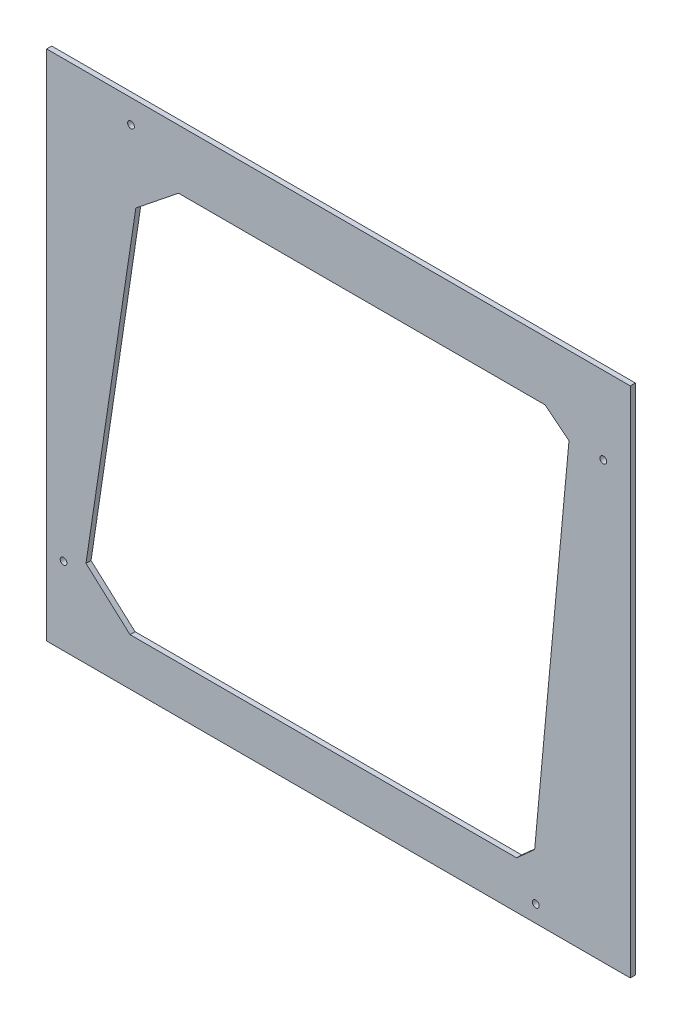
ISO-10303-21;
HEADER;
FILE_DESCRIPTION(('STEP AP214'),'2;1');
FILE_NAME('part.step','',(''),(''),'','','');
FILE_SCHEMA(('AUTOMOTIVE_DESIGN { 1 0 10303 214 1 1 1 1 }'));
ENDSEC;
DATA;
#1=APPLICATION_CONTEXT('core data for automotive mechanical design processes');
#2=APPLICATION_PROTOCOL_DEFINITION('international standard','automotive_design',2000,#1);
#3=PRODUCT_CONTEXT('',#1,'mechanical');
#4=PRODUCT('Part','Part','',(#3));
#5=PRODUCT_RELATED_PRODUCT_CATEGORY('part','',(#4));
#6=PRODUCT_DEFINITION_FORMATION('','',#4);
#7=PRODUCT_DEFINITION_CONTEXT('part definition',#1,'design');
#8=PRODUCT_DEFINITION('design','',#6,#7);
#9=PRODUCT_DEFINITION_SHAPE('','',#8);
#10=(LENGTH_UNIT() NAMED_UNIT(*) SI_UNIT(.MILLI.,.METRE.));
#11=(NAMED_UNIT(*) PLANE_ANGLE_UNIT() SI_UNIT($,.RADIAN.));
#12=(NAMED_UNIT(*) SI_UNIT($,.STERADIAN.) SOLID_ANGLE_UNIT());
#13=UNCERTAINTY_MEASURE_WITH_UNIT(LENGTH_MEASURE(1.E-05),#10,'distance_accuracy_value','');
#14=(GEOMETRIC_REPRESENTATION_CONTEXT(3) GLOBAL_UNCERTAINTY_ASSIGNED_CONTEXT((#13)) GLOBAL_UNIT_ASSIGNED_CONTEXT((#10,
#11,#12)) REPRESENTATION_CONTEXT('',''));
#15=CARTESIAN_POINT('',(0.,0.,0.));
#16=DIRECTION('',(0.,0.,1.));
#17=DIRECTION('',(1.,0.,0.));
#18=AXIS2_PLACEMENT_3D('',#15,#16,#17);
#19=CARTESIAN_POINT('',(0.,152.,3.));
#20=DIRECTION('',(0.,-1.,0.));
#21=DIRECTION('',(1.,0.,0.));
#22=AXIS2_PLACEMENT_3D('',#19,#20,#21);
#23=PLANE('',#22);
#24=DIRECTION('',(-1.,0.,0.));
#25=VECTOR('',#24,1.);
#26=CARTESIAN_POINT('',(0.,152.,0.));
#27=LINE('',#26,#25);
#28=CARTESIAN_POINT('',(176.,152.,0.));
#29=VERTEX_POINT('',#28);
#30=CARTESIAN_POINT('',(-170.,152.,0.));
#31=VERTEX_POINT('',#30);
#32=EDGE_CURVE('E195',#29,#31,#27,.T.);
#33=ORIENTED_EDGE('',*,*,#32,.T.);
#34=DIRECTION('',(0.,0.,-1.));
#35=VECTOR('',#34,1.);
#36=CARTESIAN_POINT('',(-170.,152.,3.));
#37=LINE('',#36,#35);
#38=CARTESIAN_POINT('',(-170.,152.,3.));
#39=VERTEX_POINT('',#38);
#40=EDGE_CURVE('E11',#39,#31,#37,.T.);
#41=ORIENTED_EDGE('',*,*,#40,.F.);
#42=DIRECTION('',(-1.,0.,0.));
#43=VECTOR('',#42,1.);
#44=CARTESIAN_POINT('',(0.,152.,3.));
#45=LINE('',#44,#43);
#46=CARTESIAN_POINT('',(176.,152.,3.));
#47=VERTEX_POINT('',#46);
#48=EDGE_CURVE('E142',#47,#39,#45,.T.);
#49=ORIENTED_EDGE('',*,*,#48,.F.);
#50=DIRECTION('',(0.,0.,-1.));
#51=VECTOR('',#50,1.);
#52=CARTESIAN_POINT('',(176.,152.,3.));
#53=LINE('',#52,#51);
#54=EDGE_CURVE('E58',#47,#29,#53,.T.);
#55=ORIENTED_EDGE('',*,*,#54,.T.);
#56=EDGE_LOOP('',(#33,#41,#49,#55));
#57=FACE_BOUND('',#56,.T.);
#58=ADVANCED_FACE('F39',(#57),#23,.F.);
#59=CARTESIAN_POINT('',(-170.,0.,3.));
#60=DIRECTION('',(1.,0.,0.));
#61=DIRECTION('',(0.,1.,0.));
#62=AXIS2_PLACEMENT_3D('',#59,#60,#61);
#63=PLANE('',#62);
#64=DIRECTION('',(0.,-1.,0.));
#65=VECTOR('',#64,1.);
#66=CARTESIAN_POINT('',(-170.,0.,0.));
#67=LINE('',#66,#65);
#68=CARTESIAN_POINT('',(-170.,-152.,0.));
#69=VERTEX_POINT('',#68);
#70=EDGE_CURVE('E148',#31,#69,#67,.T.);
#71=ORIENTED_EDGE('',*,*,#70,.T.);
#72=DIRECTION('',(0.,0.,-1.));
#73=VECTOR('',#72,1.);
#74=CARTESIAN_POINT('',(-170.,-152.,3.));
#75=LINE('',#74,#73);
#76=CARTESIAN_POINT('',(-170.,-152.,3.));
#77=VERTEX_POINT('',#76);
#78=EDGE_CURVE('E49',#77,#69,#75,.T.);
#79=ORIENTED_EDGE('',*,*,#78,.F.);
#80=DIRECTION('',(0.,-1.,0.));
#81=VECTOR('',#80,1.);
#82=CARTESIAN_POINT('',(-170.,0.,3.));
#83=LINE('',#82,#81);
#84=EDGE_CURVE('E136',#39,#77,#83,.T.);
#85=ORIENTED_EDGE('',*,*,#84,.F.);
#86=ORIENTED_EDGE('',*,*,#40,.T.);
#87=EDGE_LOOP('',(#71,#79,#85,#86));
#88=FACE_BOUND('',#87,.T.);
#89=ADVANCED_FACE('F147',(#88),#63,.F.);
#90=CARTESIAN_POINT('',(0.,-152.,3.));
#91=DIRECTION('',(0.,-1.,0.));
#92=DIRECTION('',(1.,0.,0.));
#93=AXIS2_PLACEMENT_3D('',#90,#91,#92);
#94=PLANE('',#93);
#95=DIRECTION('',(-1.,0.,0.));
#96=VECTOR('',#95,1.);
#97=CARTESIAN_POINT('',(0.,-152.,0.));
#98=LINE('',#97,#96);
#99=CARTESIAN_POINT('',(176.,-152.,0.));
#100=VERTEX_POINT('',#99);
#101=EDGE_CURVE('E198',#100,#69,#98,.T.);
#102=ORIENTED_EDGE('',*,*,#101,.F.);
#103=DIRECTION('',(0.,0.,-1.));
#104=VECTOR('',#103,1.);
#105=CARTESIAN_POINT('',(176.,-152.,3.));
#106=LINE('',#105,#104);
#107=CARTESIAN_POINT('',(176.,-152.,3.));
#108=VERTEX_POINT('',#107);
#109=EDGE_CURVE('E96',#108,#100,#106,.T.);
#110=ORIENTED_EDGE('',*,*,#109,.F.);
#111=DIRECTION('',(-1.,0.,0.));
#112=VECTOR('',#111,1.);
#113=CARTESIAN_POINT('',(0.,-152.,3.));
#114=LINE('',#113,#112);
#115=EDGE_CURVE('E141',#108,#77,#114,.T.);
#116=ORIENTED_EDGE('',*,*,#115,.T.);
#117=ORIENTED_EDGE('',*,*,#78,.T.);
#118=EDGE_LOOP('',(#102,#110,#116,#117));
#119=FACE_BOUND('',#118,.T.);
#120=ADVANCED_FACE('F152',(#119),#94,.T.);
#121=CARTESIAN_POINT('',(0.,117.,3.));
#122=DIRECTION('',(0.,-1.,0.));
#123=DIRECTION('',(1.,0.,0.));
#124=AXIS2_PLACEMENT_3D('',#121,#122,#123);
#125=PLANE('',#124);
#126=DIRECTION('',(-1.,0.,0.));
#127=VECTOR('',#126,1.);
#128=CARTESIAN_POINT('',(0.,117.,0.));
#129=LINE('',#128,#127);
#130=CARTESIAN_POINT('',(125.439846228343,117.,0.));
#131=VERTEX_POINT('',#130);
#132=CARTESIAN_POINT('',(-91.8234439818207,117.,0.));
#133=VERTEX_POINT('',#132);
#134=EDGE_CURVE('E159',#131,#133,#129,.T.);
#135=ORIENTED_EDGE('',*,*,#134,.F.);
#136=DIRECTION('',(0.,0.,-1.));
#137=VECTOR('',#136,1.);
#138=CARTESIAN_POINT('',(125.439846228343,117.,3.));
#139=LINE('',#138,#137);
#140=CARTESIAN_POINT('',(125.439846228343,117.,3.));
#141=VERTEX_POINT('',#140);
#142=EDGE_CURVE('E43',#141,#131,#139,.T.);
#143=ORIENTED_EDGE('',*,*,#142,.F.);
#144=DIRECTION('',(-1.,0.,0.));
#145=VECTOR('',#144,1.);
#146=CARTESIAN_POINT('',(0.,117.,3.));
#147=LINE('',#146,#145);
#148=CARTESIAN_POINT('',(-91.8234439818207,117.,3.));
#149=VERTEX_POINT('',#148);
#150=EDGE_CURVE('E203',#141,#149,#147,.T.);
#151=ORIENTED_EDGE('',*,*,#150,.T.);
#152=DIRECTION('',(0.,0.,-1.));
#153=VECTOR('',#152,1.);
#154=CARTESIAN_POINT('',(-91.8234439818207,117.,3.));
#155=LINE('',#154,#153);
#156=EDGE_CURVE('E155',#149,#133,#155,.T.);
#157=ORIENTED_EDGE('',*,*,#156,.T.);
#158=EDGE_LOOP('',(#135,#143,#151,#157));
#159=FACE_BOUND('',#158,.T.);
#160=ADVANCED_FACE('F41',(#159),#125,.T.);
#161=CARTESIAN_POINT('',(106.025305845207,132.531632306509,3.));
#162=DIRECTION('',(0.624695047554424,0.78086880944303,0.));
#163=DIRECTION('',(-0.78086880944303,0.624695047554424,0.));
#164=AXIS2_PLACEMENT_3D('',#161,#162,#163);
#165=PLANE('',#164);
#166=DIRECTION('',(0.78086880944303,-0.624695047554424,0.));
#167=VECTOR('',#166,1.);
#168=CARTESIAN_POINT('',(106.025305845207,132.531632306509,0.));
#169=LINE('',#168,#167);
#170=CARTESIAN_POINT('',(139.655171098733,105.627740103688,0.));
#171=VERTEX_POINT('',#170);
#172=EDGE_CURVE('E162',#131,#171,#169,.T.);
#173=ORIENTED_EDGE('',*,*,#172,.T.);
#174=DIRECTION('',(0.,0.,-1.));
#175=VECTOR('',#174,1.);
#176=CARTESIAN_POINT('',(139.655171098733,105.627740103688,3.));
#177=LINE('',#176,#175);
#178=CARTESIAN_POINT('',(139.655171098733,105.627740103688,3.));
#179=VERTEX_POINT('',#178);
#180=EDGE_CURVE('E216',#179,#171,#177,.T.);
#181=ORIENTED_EDGE('',*,*,#180,.F.);
#182=DIRECTION('',(0.78086880944303,-0.624695047554424,0.));
#183=VECTOR('',#182,1.);
#184=CARTESIAN_POINT('',(106.025305845207,132.531632306509,3.));
#185=LINE('',#184,#183);
#186=EDGE_CURVE('E224',#141,#179,#185,.T.);
#187=ORIENTED_EDGE('',*,*,#186,.F.);
#188=ORIENTED_EDGE('',*,*,#142,.T.);
#189=EDGE_LOOP('',(#173,#181,#187,#188));
#190=FACE_BOUND('',#189,.T.);
#191=ADVANCED_FACE('F223',(#190),#165,.F.);
#192=CARTESIAN_POINT('',(128.781294486672,-11.913688036212,3.));
#193=DIRECTION('',(-0.995748128390599,0.0921176682652097,0.));
#194=DIRECTION('',(-0.0921176682652097,-0.995748128390599,0.));
#195=AXIS2_PLACEMENT_3D('',#192,#193,#194);
#196=PLANE('',#195);
#197=DIRECTION('',(0.0921176682652097,0.995748128390599,0.));
#198=VECTOR('',#197,1.);
#199=CARTESIAN_POINT('',(128.781294486672,-11.913688036212,0.));
#200=LINE('',#199,#198);
#201=CARTESIAN_POINT('',(119.302480142772,-114.37515737265,0.));
#202=VERTEX_POINT('',#201);
#203=EDGE_CURVE('E165',#202,#171,#200,.T.);
#204=ORIENTED_EDGE('',*,*,#203,.F.);
#205=DIRECTION('',(0.,0.,-1.));
#206=VECTOR('',#205,1.);
#207=CARTESIAN_POINT('',(119.302480142772,-114.37515737265,3.));
#208=LINE('',#207,#206);
#209=CARTESIAN_POINT('',(119.302480142772,-114.37515737265,3.));
#210=VERTEX_POINT('',#209);
#211=EDGE_CURVE('E215',#210,#202,#208,.T.);
#212=ORIENTED_EDGE('',*,*,#211,.F.);
#213=DIRECTION('',(0.0921176682652097,0.995748128390599,0.));
#214=VECTOR('',#213,1.);
#215=CARTESIAN_POINT('',(128.781294486672,-11.913688036212,3.));
#216=LINE('',#215,#214);
#217=EDGE_CURVE('E515',#210,#179,#216,.T.);
#218=ORIENTED_EDGE('',*,*,#217,.T.);
#219=ORIENTED_EDGE('',*,*,#180,.T.);
#220=EDGE_LOOP('',(#204,#212,#218,#219));
#221=FACE_BOUND('',#220,.T.);
#222=ADVANCED_FACE('F257',(#221),#196,.T.);
#223=CARTESIAN_POINT('',(110.261132901122,-122.512369890136,3.));
#224=DIRECTION('',(-0.668964731622449,0.743294146247167,0.));
#225=DIRECTION('',(-0.743294146247167,-0.668964731622449,0.));
#226=AXIS2_PLACEMENT_3D('',#223,#224,#225);
#227=PLANE('',#226);
#228=DIRECTION('',(0.743294146247167,0.668964731622449,0.));
#229=VECTOR('',#228,1.);
#230=CARTESIAN_POINT('',(110.261132901122,-122.512369890136,0.));
#231=LINE('',#230,#229);
#232=CARTESIAN_POINT('',(108.608210556828,-124.,0.));
#233=VERTEX_POINT('',#232);
#234=EDGE_CURVE('E168',#233,#202,#231,.T.);
#235=ORIENTED_EDGE('',*,*,#234,.F.);
#236=DIRECTION('',(0.,0.,-1.));
#237=VECTOR('',#236,1.);
#238=CARTESIAN_POINT('',(108.608210556828,-124.,3.));
#239=LINE('',#238,#237);
#240=CARTESIAN_POINT('',(108.608210556828,-124.,3.));
#241=VERTEX_POINT('',#240);
#242=EDGE_CURVE('E213',#241,#233,#239,.T.);
#243=ORIENTED_EDGE('',*,*,#242,.F.);
#244=DIRECTION('',(0.743294146247167,0.668964731622449,0.));
#245=VECTOR('',#244,1.);
#246=CARTESIAN_POINT('',(110.261132901122,-122.512369890136,3.));
#247=LINE('',#246,#245);
#248=EDGE_CURVE('E255',#241,#210,#247,.T.);
#249=ORIENTED_EDGE('',*,*,#248,.T.);
#250=ORIENTED_EDGE('',*,*,#211,.T.);
#251=EDGE_LOOP('',(#235,#243,#249,#250));
#252=FACE_BOUND('',#251,.T.);
#253=ADVANCED_FACE('F252',(#252),#227,.T.);
#254=CARTESIAN_POINT('',(0.,-124.,3.));
#255=DIRECTION('',(0.,-1.,0.));
#256=DIRECTION('',(0.,0.,-1.));
#257=AXIS2_PLACEMENT_3D('',#254,#255,#256);
#258=PLANE('',#257);
#259=DIRECTION('',(-1.,0.,0.));
#260=VECTOR('',#259,1.);
#261=CARTESIAN_POINT('',(0.,-124.,0.));
#262=LINE('',#261,#260);
#263=CARTESIAN_POINT('',(-120.56698748756,-124.,0.));
#264=VERTEX_POINT('',#263);
#265=EDGE_CURVE('E171',#233,#264,#262,.T.);
#266=ORIENTED_EDGE('',*,*,#265,.T.);
#267=DIRECTION('',(0.,0.,-1.));
#268=VECTOR('',#267,1.);
#269=CARTESIAN_POINT('',(-120.56698748756,-124.,3.));
#270=LINE('',#269,#268);
#271=CARTESIAN_POINT('',(-120.56698748756,-124.,3.));
#272=VERTEX_POINT('',#271);
#273=EDGE_CURVE('E211',#272,#264,#270,.T.);
#274=ORIENTED_EDGE('',*,*,#273,.F.);
#275=DIRECTION('',(-1.,0.,0.));
#276=VECTOR('',#275,1.);
#277=CARTESIAN_POINT('',(0.,-124.,3.));
#278=LINE('',#277,#276);
#279=EDGE_CURVE('E512',#241,#272,#278,.T.);
#280=ORIENTED_EDGE('',*,*,#279,.F.);
#281=ORIENTED_EDGE('',*,*,#242,.T.);
#282=EDGE_LOOP('',(#266,#274,#280,#281));
#283=FACE_BOUND('',#282,.T.);
#284=ADVANCED_FACE('F249',(#283),#258,.F.);
#285=CARTESIAN_POINT('',(-115.612850754102,-128.458723060113,3.));
#286=DIRECTION('',(0.66896473162245,0.743294146247166,0.));
#287=DIRECTION('',(-0.743294146247166,0.66896473162245,0.));
#288=AXIS2_PLACEMENT_3D('',#285,#286,#287);
#289=PLANE('',#288);
#290=DIRECTION('',(0.743294146247166,-0.66896473162245,0.));
#291=VECTOR('',#290,1.);
#292=CARTESIAN_POINT('',(-115.612850754102,-128.458723060113,0.));
#293=LINE('',#292,#291);
#294=CARTESIAN_POINT('',(-146.68324588641,-100.495367441035,0.));
#295=VERTEX_POINT('',#294);
#296=EDGE_CURVE('E174',#295,#264,#293,.T.);
#297=ORIENTED_EDGE('',*,*,#296,.F.);
#298=DIRECTION('',(0.,0.,-1.));
#299=VECTOR('',#298,1.);
#300=CARTESIAN_POINT('',(-146.68324588641,-100.495367441035,3.));
#301=LINE('',#300,#299);
#302=CARTESIAN_POINT('',(-146.68324588641,-100.495367441035,3.));
#303=VERTEX_POINT('',#302);
#304=EDGE_CURVE('E209',#303,#295,#301,.T.);
#305=ORIENTED_EDGE('',*,*,#304,.F.);
#306=DIRECTION('',(0.743294146247166,-0.66896473162245,0.));
#307=VECTOR('',#306,1.);
#308=CARTESIAN_POINT('',(-115.612850754102,-128.458723060113,3.));
#309=LINE('',#308,#307);
#310=EDGE_CURVE('E246',#303,#272,#309,.T.);
#311=ORIENTED_EDGE('',*,*,#310,.T.);
#312=ORIENTED_EDGE('',*,*,#273,.T.);
#313=EDGE_LOOP('',(#297,#305,#311,#312));
#314=FACE_BOUND('',#313,.T.);
#315=ADVANCED_FACE('F241',(#314),#289,.T.);
#316=CARTESIAN_POINT('',(-128.742862890213,19.2830719747456,3.));
#317=DIRECTION('',(-0.98896828607144,0.148127408486471,0.));
#318=DIRECTION('',(-0.148127408486471,-0.98896828607144,0.));
#319=AXIS2_PLACEMENT_3D('',#316,#317,#318);
#320=PLANE('',#319);
#321=DIRECTION('',(0.148127408486471,0.98896828607144,0.));
#322=VECTOR('',#321,1.);
#323=CARTESIAN_POINT('',(-128.742862890213,19.2830719747456,0.));
#324=LINE('',#323,#322);
#325=CARTESIAN_POINT('',(-117.14042365823,96.746416258873,0.));
#326=VERTEX_POINT('',#325);
#327=EDGE_CURVE('E177',#295,#326,#324,.T.);
#328=ORIENTED_EDGE('',*,*,#327,.T.);
#329=DIRECTION('',(0.,0.,-1.));
#330=VECTOR('',#329,1.);
#331=CARTESIAN_POINT('',(-117.14042365823,96.746416258873,3.));
#332=LINE('',#331,#330);
#333=CARTESIAN_POINT('',(-117.14042365823,96.746416258873,3.));
#334=VERTEX_POINT('',#333);
#335=EDGE_CURVE('E207',#334,#326,#332,.T.);
#336=ORIENTED_EDGE('',*,*,#335,.F.);
#337=DIRECTION('',(0.148127408486471,0.98896828607144,0.));
#338=VECTOR('',#337,1.);
#339=CARTESIAN_POINT('',(-128.742862890213,19.2830719747456,3.));
#340=LINE('',#339,#338);
#341=EDGE_CURVE('E509',#303,#334,#340,.T.);
#342=ORIENTED_EDGE('',*,*,#341,.F.);
#343=ORIENTED_EDGE('',*,*,#304,.T.);
#344=EDGE_LOOP('',(#328,#336,#342,#343));
#345=FACE_BOUND('',#344,.T.);
#346=ADVANCED_FACE('F277',(#345),#320,.F.);
#347=CARTESIAN_POINT('',(-120.,138.,3.));
#348=DIRECTION('',(0.,0.,-1.));
#349=DIRECTION('',(-1.,0.,0.));
#350=AXIS2_PLACEMENT_3D('',#347,#348,#349);
#351=CYLINDRICAL_SURFACE('',#350,2.);
#352=CARTESIAN_POINT('',(-120.,138.,3.));
#353=DIRECTION('',(0.,0.,1.));
#354=DIRECTION('',(1.,0.,0.));
#355=AXIS2_PLACEMENT_3D('',#352,#353,#354);
#356=CIRCLE('',#355,2.);
#357=CARTESIAN_POINT('',(-118.,138.,3.));
#358=VERTEX_POINT('',#357);
#359=EDGE_CURVE('E502',#358,#358,#356,.T.);
#360=ORIENTED_EDGE('',*,*,#359,.T.);
#361=EDGE_LOOP('',(#360));
#362=FACE_BOUND('',#361,.T.);
#363=CARTESIAN_POINT('',(-120.,138.,0.));
#364=DIRECTION('',(0.,0.,1.));
#365=DIRECTION('',(1.,0.,0.));
#366=AXIS2_PLACEMENT_3D('',#363,#364,#365);
#367=CIRCLE('',#366,2.);
#368=CARTESIAN_POINT('',(-118.,138.,0.));
#369=VERTEX_POINT('',#368);
#370=EDGE_CURVE('E192',#369,#369,#367,.T.);
#371=ORIENTED_EDGE('',*,*,#370,.F.);
#372=EDGE_LOOP('',(#371));
#373=FACE_BOUND('',#372,.T.);
#374=ADVANCED_FACE('F273',(#362,#373),#351,.F.);
#375=CARTESIAN_POINT('',(120.,-142.,3.));
#376=DIRECTION('',(0.,0.,-1.));
#377=DIRECTION('',(-1.,0.,0.));
#378=AXIS2_PLACEMENT_3D('',#375,#376,#377);
#379=CYLINDRICAL_SURFACE('',#378,2.);
#380=CARTESIAN_POINT('',(120.,-142.,3.));
#381=DIRECTION('',(0.,0.,1.));
#382=DIRECTION('',(1.,0.,0.));
#383=AXIS2_PLACEMENT_3D('',#380,#381,#382);
#384=CIRCLE('',#383,2.);
#385=CARTESIAN_POINT('',(122.,-142.,3.));
#386=VERTEX_POINT('',#385);
#387=EDGE_CURVE('E499',#386,#386,#384,.T.);
#388=ORIENTED_EDGE('',*,*,#387,.T.);
#389=EDGE_LOOP('',(#388));
#390=FACE_BOUND('',#389,.T.);
#391=CARTESIAN_POINT('',(120.,-142.,0.));
#392=DIRECTION('',(0.,0.,1.));
#393=DIRECTION('',(1.,0.,0.));
#394=AXIS2_PLACEMENT_3D('',#391,#392,#393);
#395=CIRCLE('',#394,2.);
#396=CARTESIAN_POINT('',(122.,-142.,0.));
#397=VERTEX_POINT('',#396);
#398=EDGE_CURVE('E189',#397,#397,#395,.T.);
#399=ORIENTED_EDGE('',*,*,#398,.F.);
#400=EDGE_LOOP('',(#399));
#401=FACE_BOUND('',#400,.T.);
#402=ADVANCED_FACE('F276',(#390,#401),#379,.F.);
#403=CARTESIAN_POINT('',(-160.,-106.,3.));
#404=DIRECTION('',(0.,0.,-1.));
#405=DIRECTION('',(-1.,0.,0.));
#406=AXIS2_PLACEMENT_3D('',#403,#404,#405);
#407=CYLINDRICAL_SURFACE('',#406,2.);
#408=CARTESIAN_POINT('',(-160.,-106.,3.));
#409=DIRECTION('',(0.,0.,1.));
#410=DIRECTION('',(1.,0.,0.));
#411=AXIS2_PLACEMENT_3D('',#408,#409,#410);
#412=CIRCLE('',#411,2.);
#413=CARTESIAN_POINT('',(-158.,-106.,3.));
#414=VERTEX_POINT('',#413);
#415=EDGE_CURVE('E495',#414,#414,#412,.T.);
#416=ORIENTED_EDGE('',*,*,#415,.T.);
#417=EDGE_LOOP('',(#416));
#418=FACE_BOUND('',#417,.T.);
#419=CARTESIAN_POINT('',(-160.,-106.,0.));
#420=DIRECTION('',(0.,0.,1.));
#421=DIRECTION('',(1.,0.,0.));
#422=AXIS2_PLACEMENT_3D('',#419,#420,#421);
#423=CIRCLE('',#422,2.);
#424=CARTESIAN_POINT('',(-158.,-106.,0.));
#425=VERTEX_POINT('',#424);
#426=EDGE_CURVE('E186',#425,#425,#423,.T.);
#427=ORIENTED_EDGE('',*,*,#426,.F.);
#428=EDGE_LOOP('',(#427));
#429=FACE_BOUND('',#428,.T.);
#430=ADVANCED_FACE('F281',(#418,#429),#407,.F.);
#431=CARTESIAN_POINT('',(160.,106.,3.));
#432=DIRECTION('',(0.,0.,-1.));
#433=DIRECTION('',(-1.,0.,0.));
#434=AXIS2_PLACEMENT_3D('',#431,#432,#433);
#435=CYLINDRICAL_SURFACE('',#434,2.);
#436=CARTESIAN_POINT('',(160.,106.,3.));
#437=DIRECTION('',(0.,0.,1.));
#438=DIRECTION('',(1.,0.,0.));
#439=AXIS2_PLACEMENT_3D('',#436,#437,#438);
#440=CIRCLE('',#439,2.);
#441=CARTESIAN_POINT('',(162.,106.,3.));
#442=VERTEX_POINT('',#441);
#443=EDGE_CURVE('E491',#442,#442,#440,.T.);
#444=ORIENTED_EDGE('',*,*,#443,.T.);
#445=EDGE_LOOP('',(#444));
#446=FACE_BOUND('',#445,.T.);
#447=CARTESIAN_POINT('',(160.,106.,0.));
#448=DIRECTION('',(0.,0.,1.));
#449=DIRECTION('',(1.,0.,0.));
#450=AXIS2_PLACEMENT_3D('',#447,#448,#449);
#451=CIRCLE('',#450,2.);
#452=CARTESIAN_POINT('',(162.,106.,0.));
#453=VERTEX_POINT('',#452);
#454=EDGE_CURVE('E183',#453,#453,#451,.T.);
#455=ORIENTED_EDGE('',*,*,#454,.F.);
#456=EDGE_LOOP('',(#455));
#457=FACE_BOUND('',#456,.T.);
#458=ADVANCED_FACE('F285',(#446,#457),#435,.F.);
#459=CARTESIAN_POINT('',(-92.9067098465642,116.133387308205,3.));
#460=DIRECTION('',(0.624695047554424,-0.78086880944303,0.));
#461=DIRECTION('',(0.78086880944303,0.624695047554424,0.));
#462=AXIS2_PLACEMENT_3D('',#459,#460,#461);
#463=PLANE('',#462);
#464=DIRECTION('',(-0.78086880944303,-0.624695047554424,0.));
#465=VECTOR('',#464,1.);
#466=CARTESIAN_POINT('',(-92.9067098465642,116.133387308205,0.));
#467=LINE('',#466,#465);
#468=EDGE_CURVE('E180',#133,#326,#467,.T.);
#469=ORIENTED_EDGE('',*,*,#468,.F.);
#470=ORIENTED_EDGE('',*,*,#156,.F.);
#471=DIRECTION('',(-0.78086880944303,-0.624695047554424,0.));
#472=VECTOR('',#471,1.);
#473=CARTESIAN_POINT('',(-92.9067098465642,116.133387308205,3.));
#474=LINE('',#473,#472);
#475=EDGE_CURVE('E234',#149,#334,#474,.T.);
#476=ORIENTED_EDGE('',*,*,#475,.T.);
#477=ORIENTED_EDGE('',*,*,#335,.T.);
#478=EDGE_LOOP('',(#469,#470,#476,#477));
#479=FACE_BOUND('',#478,.T.);
#480=ADVANCED_FACE('F233',(#479),#463,.T.);
#481=CARTESIAN_POINT('',(176.,0.,3.));
#482=DIRECTION('',(1.,0.,0.));
#483=DIRECTION('',(0.,0.,-1.));
#484=AXIS2_PLACEMENT_3D('',#481,#482,#483);
#485=PLANE('',#484);
#486=DIRECTION('',(0.,-1.,0.));
#487=VECTOR('',#486,1.);
#488=CARTESIAN_POINT('',(176.,0.,0.));
#489=LINE('',#488,#487);
#490=EDGE_CURVE('E200',#29,#100,#489,.T.);
#491=ORIENTED_EDGE('',*,*,#490,.F.);
#492=ORIENTED_EDGE('',*,*,#54,.F.);
#493=DIRECTION('',(0.,-1.,0.));
#494=VECTOR('',#493,1.);
#495=CARTESIAN_POINT('',(176.,0.,3.));
#496=LINE('',#495,#494);
#497=EDGE_CURVE('E153',#47,#108,#496,.T.);
#498=ORIENTED_EDGE('',*,*,#497,.T.);
#499=ORIENTED_EDGE('',*,*,#109,.T.);
#500=EDGE_LOOP('',(#491,#492,#498,#499));
#501=FACE_BOUND('',#500,.T.);
#502=ADVANCED_FACE('F292',(#501),#485,.T.);
#503=CARTESIAN_POINT('',(0.,0.,3.));
#504=DIRECTION('',(0.,0.,1.));
#505=DIRECTION('',(1.,0.,0.));
#506=AXIS2_PLACEMENT_3D('',#503,#504,#505);
#507=PLANE('',#506);
#508=ORIENTED_EDGE('',*,*,#150,.F.);
#509=ORIENTED_EDGE('',*,*,#186,.T.);
#510=ORIENTED_EDGE('',*,*,#217,.F.);
#511=ORIENTED_EDGE('',*,*,#248,.F.);
#512=ORIENTED_EDGE('',*,*,#279,.T.);
#513=ORIENTED_EDGE('',*,*,#310,.F.);
#514=ORIENTED_EDGE('',*,*,#341,.T.);
#515=ORIENTED_EDGE('',*,*,#475,.F.);
#516=EDGE_LOOP('',(#508,#509,#510,#511,#512,#513,#514,#515));
#517=FACE_BOUND('',#516,.T.);
#518=ORIENTED_EDGE('',*,*,#443,.F.);
#519=EDGE_LOOP('',(#518));
#520=FACE_BOUND('',#519,.T.);
#521=ORIENTED_EDGE('',*,*,#415,.F.);
#522=EDGE_LOOP('',(#521));
#523=FACE_BOUND('',#522,.T.);
#524=ORIENTED_EDGE('',*,*,#387,.F.);
#525=EDGE_LOOP('',(#524));
#526=FACE_BOUND('',#525,.T.);
#527=ORIENTED_EDGE('',*,*,#359,.F.);
#528=EDGE_LOOP('',(#527));
#529=FACE_BOUND('',#528,.T.);
#530=ORIENTED_EDGE('',*,*,#48,.T.);
#531=ORIENTED_EDGE('',*,*,#84,.T.);
#532=ORIENTED_EDGE('',*,*,#115,.F.);
#533=ORIENTED_EDGE('',*,*,#497,.F.);
#534=EDGE_LOOP('',(#530,#531,#532,#533));
#535=FACE_BOUND('',#534,.T.);
#536=ADVANCED_FACE('F138',(#517,#520,#523,#526,#529,#535),#507,.T.);
#537=CARTESIAN_POINT('',(0.,0.,0.));
#538=DIRECTION('',(0.,0.,1.));
#539=DIRECTION('',(1.,0.,0.));
#540=AXIS2_PLACEMENT_3D('',#537,#538,#539);
#541=PLANE('',#540);
#542=ORIENTED_EDGE('',*,*,#134,.T.);
#543=ORIENTED_EDGE('',*,*,#468,.T.);
#544=ORIENTED_EDGE('',*,*,#327,.F.);
#545=ORIENTED_EDGE('',*,*,#296,.T.);
#546=ORIENTED_EDGE('',*,*,#265,.F.);
#547=ORIENTED_EDGE('',*,*,#234,.T.);
#548=ORIENTED_EDGE('',*,*,#203,.T.);
#549=ORIENTED_EDGE('',*,*,#172,.F.);
#550=EDGE_LOOP('',(#542,#543,#544,#545,#546,#547,#548,#549));
#551=FACE_BOUND('',#550,.T.);
#552=ORIENTED_EDGE('',*,*,#454,.T.);
#553=EDGE_LOOP('',(#552));
#554=FACE_BOUND('',#553,.T.);
#555=ORIENTED_EDGE('',*,*,#426,.T.);
#556=EDGE_LOOP('',(#555));
#557=FACE_BOUND('',#556,.T.);
#558=ORIENTED_EDGE('',*,*,#398,.T.);
#559=EDGE_LOOP('',(#558));
#560=FACE_BOUND('',#559,.T.);
#561=ORIENTED_EDGE('',*,*,#370,.T.);
#562=EDGE_LOOP('',(#561));
#563=FACE_BOUND('',#562,.T.);
#564=ORIENTED_EDGE('',*,*,#32,.F.);
#565=ORIENTED_EDGE('',*,*,#490,.T.);
#566=ORIENTED_EDGE('',*,*,#101,.T.);
#567=ORIENTED_EDGE('',*,*,#70,.F.);
#568=EDGE_LOOP('',(#564,#565,#566,#567));
#569=FACE_BOUND('',#568,.T.);
#570=ADVANCED_FACE('F227',(#551,#554,#557,#560,#563,#569),#541,.F.);
#571=CLOSED_SHELL('',(#58,#89,#120,#160,#191,#222,#253,#284,#315,#346,#374,#402,#430,#458,#480,
#502,#536,#570));
#572=MANIFOLD_SOLID_BREP('B2',#571);
#573=ADVANCED_BREP_SHAPE_REPRESENTATION('',(#18,#572),#14);
#574=SHAPE_DEFINITION_REPRESENTATION(#9,#573);
ENDSEC;
END-ISO-10303-21;
